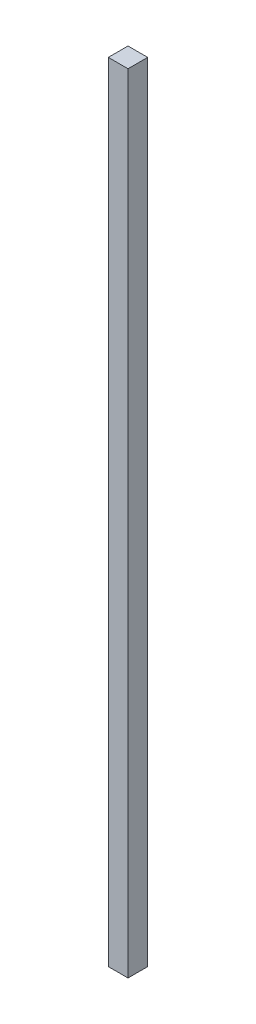
ISO-10303-21;
HEADER;
FILE_DESCRIPTION(('STEP AP214'),'2;1');
FILE_NAME('part.step','',(''),(''),'','','');
FILE_SCHEMA(('AUTOMOTIVE_DESIGN { 1 0 10303 214 1 1 1 1 }'));
ENDSEC;
DATA;
#1=APPLICATION_CONTEXT('core data for automotive mechanical design processes');
#2=APPLICATION_PROTOCOL_DEFINITION('international standard','automotive_design',2000,#1);
#3=PRODUCT_CONTEXT('',#1,'mechanical');
#4=PRODUCT('Part','Part','',(#3));
#5=PRODUCT_RELATED_PRODUCT_CATEGORY('part','',(#4));
#6=PRODUCT_DEFINITION_FORMATION('','',#4);
#7=PRODUCT_DEFINITION_CONTEXT('part definition',#1,'design');
#8=PRODUCT_DEFINITION('design','',#6,#7);
#9=PRODUCT_DEFINITION_SHAPE('','',#8);
#10=(LENGTH_UNIT() NAMED_UNIT(*) SI_UNIT(.MILLI.,.METRE.));
#11=(NAMED_UNIT(*) PLANE_ANGLE_UNIT() SI_UNIT($,.RADIAN.));
#12=(NAMED_UNIT(*) SI_UNIT($,.STERADIAN.) SOLID_ANGLE_UNIT());
#13=UNCERTAINTY_MEASURE_WITH_UNIT(LENGTH_MEASURE(1.E-05),#10,'distance_accuracy_value','');
#14=(GEOMETRIC_REPRESENTATION_CONTEXT(3) GLOBAL_UNCERTAINTY_ASSIGNED_CONTEXT((#13)) GLOBAL_UNIT_ASSIGNED_CONTEXT((#10,
#11,#12)) REPRESENTATION_CONTEXT('',''));
#15=CARTESIAN_POINT('',(0.,0.,0.));
#16=DIRECTION('',(0.,0.,1.));
#17=DIRECTION('',(1.,0.,0.));
#18=AXIS2_PLACEMENT_3D('',#15,#16,#17);
#19=CARTESIAN_POINT('',(1.5875,127.,-1.5875));
#20=DIRECTION('',(-1.,0.,0.));
#21=DIRECTION('',(0.,0.,1.));
#22=AXIS2_PLACEMENT_3D('',#19,#20,#21);
#23=PLANE('',#22);
#24=DIRECTION('',(0.,0.,-1.));
#25=VECTOR('',#24,1.);
#26=CARTESIAN_POINT('',(1.5875,0.,-1.5875));
#27=LINE('',#26,#25);
#28=CARTESIAN_POINT('',(1.5875,0.,1.5875));
#29=VERTEX_POINT('',#28);
#30=CARTESIAN_POINT('',(1.5875,0.,-1.5875));
#31=VERTEX_POINT('',#30);
#32=EDGE_CURVE('E96',#29,#31,#27,.T.);
#33=ORIENTED_EDGE('',*,*,#32,.T.);
#34=DIRECTION('',(0.,-1.,0.));
#35=VECTOR('',#34,1.);
#36=CARTESIAN_POINT('',(1.5875,127.,-1.5875));
#37=LINE('',#36,#35);
#38=CARTESIAN_POINT('',(1.5875,127.,-1.5875));
#39=VERTEX_POINT('',#38);
#40=EDGE_CURVE('E11',#39,#31,#37,.T.);
#41=ORIENTED_EDGE('',*,*,#40,.F.);
#42=DIRECTION('',(0.,0.,-1.));
#43=VECTOR('',#42,1.);
#44=CARTESIAN_POINT('',(1.5875,127.,-1.5875));
#45=LINE('',#44,#43);
#46=CARTESIAN_POINT('',(1.5875,127.,1.5875));
#47=VERTEX_POINT('',#46);
#48=EDGE_CURVE('E84',#47,#39,#45,.T.);
#49=ORIENTED_EDGE('',*,*,#48,.F.);
#50=DIRECTION('',(0.,-1.,0.));
#51=VECTOR('',#50,1.);
#52=CARTESIAN_POINT('',(1.5875,127.,1.5875));
#53=LINE('',#52,#51);
#54=EDGE_CURVE('E92',#47,#29,#53,.T.);
#55=ORIENTED_EDGE('',*,*,#54,.T.);
#56=EDGE_LOOP('',(#33,#41,#49,#55));
#57=FACE_BOUND('',#56,.T.);
#58=ADVANCED_FACE('F33',(#57),#23,.F.);
#59=CARTESIAN_POINT('',(-1.5875,127.,-1.5875));
#60=DIRECTION('',(0.,0.,1.));
#61=DIRECTION('',(1.,0.,0.));
#62=AXIS2_PLACEMENT_3D('',#59,#60,#61);
#63=PLANE('',#62);
#64=DIRECTION('',(-1.,0.,0.));
#65=VECTOR('',#64,1.);
#66=CARTESIAN_POINT('',(-1.5875,0.,-1.5875));
#67=LINE('',#66,#65);
#68=CARTESIAN_POINT('',(-1.5875,0.,-1.5875));
#69=VERTEX_POINT('',#68);
#70=EDGE_CURVE('E88',#31,#69,#67,.T.);
#71=ORIENTED_EDGE('',*,*,#70,.T.);
#72=DIRECTION('',(0.,-1.,0.));
#73=VECTOR('',#72,1.);
#74=CARTESIAN_POINT('',(-1.5875,127.,-1.5875));
#75=LINE('',#74,#73);
#76=CARTESIAN_POINT('',(-1.5875,127.,-1.5875));
#77=VERTEX_POINT('',#76);
#78=EDGE_CURVE('E41',#77,#69,#75,.T.);
#79=ORIENTED_EDGE('',*,*,#78,.F.);
#80=DIRECTION('',(-1.,0.,0.));
#81=VECTOR('',#80,1.);
#82=CARTESIAN_POINT('',(-1.5875,127.,-1.5875));
#83=LINE('',#82,#81);
#84=EDGE_CURVE('E79',#39,#77,#83,.T.);
#85=ORIENTED_EDGE('',*,*,#84,.F.);
#86=ORIENTED_EDGE('',*,*,#40,.T.);
#87=EDGE_LOOP('',(#71,#79,#85,#86));
#88=FACE_BOUND('',#87,.T.);
#89=ADVANCED_FACE('F87',(#88),#63,.F.);
#90=CARTESIAN_POINT('',(-1.5875,127.,-1.5875));
#91=DIRECTION('',(1.,0.,0.));
#92=DIRECTION('',(0.,0.,-1.));
#93=AXIS2_PLACEMENT_3D('',#90,#91,#92);
#94=PLANE('',#93);
#95=DIRECTION('',(0.,0.,1.));
#96=VECTOR('',#95,1.);
#97=CARTESIAN_POINT('',(-1.5875,0.,-1.5875));
#98=LINE('',#97,#96);
#99=CARTESIAN_POINT('',(-1.5875,0.,1.5875));
#100=VERTEX_POINT('',#99);
#101=EDGE_CURVE('E66',#69,#100,#98,.T.);
#102=ORIENTED_EDGE('',*,*,#101,.T.);
#103=DIRECTION('',(0.,-1.,0.));
#104=VECTOR('',#103,1.);
#105=CARTESIAN_POINT('',(-1.5875,127.,1.5875));
#106=LINE('',#105,#104);
#107=CARTESIAN_POINT('',(-1.5875,127.,1.5875));
#108=VERTEX_POINT('',#107);
#109=EDGE_CURVE('E89',#108,#100,#106,.T.);
#110=ORIENTED_EDGE('',*,*,#109,.F.);
#111=DIRECTION('',(0.,0.,1.));
#112=VECTOR('',#111,1.);
#113=CARTESIAN_POINT('',(-1.5875,127.,-1.5875));
#114=LINE('',#113,#112);
#115=EDGE_CURVE('E82',#77,#108,#114,.T.);
#116=ORIENTED_EDGE('',*,*,#115,.F.);
#117=ORIENTED_EDGE('',*,*,#78,.T.);
#118=EDGE_LOOP('',(#102,#110,#116,#117));
#119=FACE_BOUND('',#118,.T.);
#120=ADVANCED_FACE('F90',(#119),#94,.F.);
#121=CARTESIAN_POINT('',(-1.5875,127.,1.5875));
#122=DIRECTION('',(0.,0.,-1.));
#123=DIRECTION('',(-1.,0.,0.));
#124=AXIS2_PLACEMENT_3D('',#121,#122,#123);
#125=PLANE('',#124);
#126=DIRECTION('',(1.,0.,0.));
#127=VECTOR('',#126,1.);
#128=CARTESIAN_POINT('',(-1.5875,0.,1.5875));
#129=LINE('',#128,#127);
#130=EDGE_CURVE('E72',#100,#29,#129,.T.);
#131=ORIENTED_EDGE('',*,*,#130,.T.);
#132=ORIENTED_EDGE('',*,*,#54,.F.);
#133=DIRECTION('',(1.,0.,0.));
#134=VECTOR('',#133,1.);
#135=CARTESIAN_POINT('',(-1.5875,127.,1.5875));
#136=LINE('',#135,#134);
#137=EDGE_CURVE('E49',#108,#47,#136,.T.);
#138=ORIENTED_EDGE('',*,*,#137,.F.);
#139=ORIENTED_EDGE('',*,*,#109,.T.);
#140=EDGE_LOOP('',(#131,#132,#138,#139));
#141=FACE_BOUND('',#140,.T.);
#142=ADVANCED_FACE('F103',(#141),#125,.F.);
#143=CARTESIAN_POINT('',(0.,127.,0.));
#144=DIRECTION('',(0.,1.,0.));
#145=DIRECTION('',(0.,0.,1.));
#146=AXIS2_PLACEMENT_3D('',#143,#144,#145);
#147=PLANE('',#146);
#148=ORIENTED_EDGE('',*,*,#48,.T.);
#149=ORIENTED_EDGE('',*,*,#84,.T.);
#150=ORIENTED_EDGE('',*,*,#115,.T.);
#151=ORIENTED_EDGE('',*,*,#137,.T.);
#152=EDGE_LOOP('',(#148,#149,#150,#151));
#153=FACE_BOUND('',#152,.T.);
#154=ADVANCED_FACE('F80',(#153),#147,.T.);
#155=CARTESIAN_POINT('',(0.,0.,0.));
#156=DIRECTION('',(0.,1.,0.));
#157=DIRECTION('',(0.,0.,1.));
#158=AXIS2_PLACEMENT_3D('',#155,#156,#157);
#159=PLANE('',#158);
#160=ORIENTED_EDGE('',*,*,#32,.F.);
#161=ORIENTED_EDGE('',*,*,#130,.F.);
#162=ORIENTED_EDGE('',*,*,#101,.F.);
#163=ORIENTED_EDGE('',*,*,#70,.F.);
#164=EDGE_LOOP('',(#160,#161,#162,#163));
#165=FACE_BOUND('',#164,.T.);
#166=ADVANCED_FACE('F106',(#165),#159,.F.);
#167=CLOSED_SHELL('',(#58,#89,#120,#142,#154,#166));
#168=MANIFOLD_SOLID_BREP('B2',#167);
#169=ADVANCED_BREP_SHAPE_REPRESENTATION('',(#18,#168),#14);
#170=SHAPE_DEFINITION_REPRESENTATION(#9,#169);
ENDSEC;
END-ISO-10303-21;
